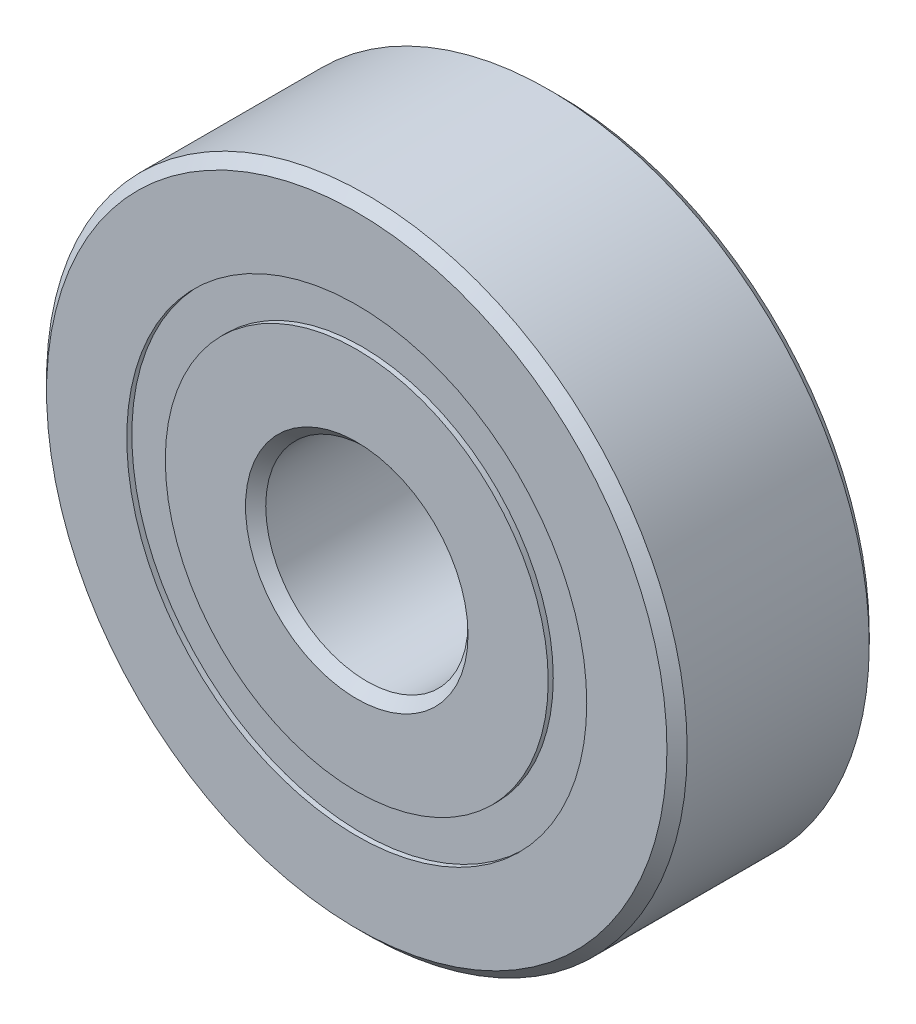
ISO-10303-21;
HEADER;
FILE_DESCRIPTION(('STEP AP214'),'2;1');
FILE_NAME('part.step','',(''),(''),'','','');
FILE_SCHEMA(('AUTOMOTIVE_DESIGN { 1 0 10303 214 1 1 1 1 }'));
ENDSEC;
DATA;
#1=APPLICATION_CONTEXT('core data for automotive mechanical design processes');
#2=APPLICATION_PROTOCOL_DEFINITION('international standard','automotive_design',2000,#1);
#3=PRODUCT_CONTEXT('',#1,'mechanical');
#4=PRODUCT('Part','Part','',(#3));
#5=PRODUCT_RELATED_PRODUCT_CATEGORY('part','',(#4));
#6=PRODUCT_DEFINITION_FORMATION('','',#4);
#7=PRODUCT_DEFINITION_CONTEXT('part definition',#1,'design');
#8=PRODUCT_DEFINITION('design','',#6,#7);
#9=PRODUCT_DEFINITION_SHAPE('','',#8);
#10=(LENGTH_UNIT() NAMED_UNIT(*) SI_UNIT(.MILLI.,.METRE.));
#11=(NAMED_UNIT(*) PLANE_ANGLE_UNIT() SI_UNIT($,.RADIAN.));
#12=(NAMED_UNIT(*) SI_UNIT($,.STERADIAN.) SOLID_ANGLE_UNIT());
#13=UNCERTAINTY_MEASURE_WITH_UNIT(LENGTH_MEASURE(1.E-05),#10,'distance_accuracy_value','');
#14=(GEOMETRIC_REPRESENTATION_CONTEXT(3) GLOBAL_UNCERTAINTY_ASSIGNED_CONTEXT((#13)) GLOBAL_UNIT_ASSIGNED_CONTEXT((#10,
#11,#12)) REPRESENTATION_CONTEXT('',''));
#15=CARTESIAN_POINT('',(0.,0.,0.));
#16=DIRECTION('',(0.,0.,1.));
#17=DIRECTION('',(1.,0.,0.));
#18=AXIS2_PLACEMENT_3D('',#15,#16,#17);
#19=CARTESIAN_POINT('',(0.,6.82142857142857,-2.85));
#20=DIRECTION('',(0.,0.,1.));
#21=DIRECTION('',(1.,0.,0.));
#22=AXIS2_PLACEMENT_3D('',#19,#20,#21);
#23=PLANE('',#22);
#24=CARTESIAN_POINT('',(0.,0.,-2.85));
#25=DIRECTION('',(0.,0.,1.));
#26=DIRECTION('',(1.,0.,0.));
#27=AXIS2_PLACEMENT_3D('',#24,#25,#26);
#28=CIRCLE('',#27,6.82142857142857);
#29=CARTESIAN_POINT('',(6.82142857142857,0.,-2.85));
#30=VERTEX_POINT('',#29);
#31=EDGE_CURVE('E55',#30,#30,#28,.T.);
#32=ORIENTED_EDGE('',*,*,#31,.F.);
#33=EDGE_LOOP('',(#32));
#34=FACE_BOUND('',#33,.T.);
#35=CARTESIAN_POINT('',(0.,0.,-2.85));
#36=DIRECTION('',(0.,0.,1.));
#37=DIRECTION('',(1.,0.,0.));
#38=AXIS2_PLACEMENT_3D('',#35,#36,#37);
#39=CIRCLE('',#38,5.67857142857143);
#40=CARTESIAN_POINT('',(5.67857142857143,0.,-2.85));
#41=VERTEX_POINT('',#40);
#42=EDGE_CURVE('E11',#41,#41,#39,.T.);
#43=ORIENTED_EDGE('',*,*,#42,.T.);
#44=EDGE_LOOP('',(#43));
#45=FACE_BOUND('',#44,.T.);
#46=ADVANCED_FACE('F41',(#34,#45),#23,.F.);
#47=CARTESIAN_POINT('',(0.,0.,3.));
#48=DIRECTION('',(0.,0.,1.));
#49=DIRECTION('',(1.,0.,0.));
#50=AXIS2_PLACEMENT_3D('',#47,#48,#49);
#51=CYLINDRICAL_SURFACE('',#50,5.67857142857143);
#52=ORIENTED_EDGE('',*,*,#42,.F.);
#53=EDGE_LOOP('',(#52));
#54=FACE_BOUND('',#53,.T.);
#55=CARTESIAN_POINT('',(0.,0.,-1.45062344873598));
#56=DIRECTION('',(0.,0.,1.));
#57=DIRECTION('',(1.,0.,0.));
#58=AXIS2_PLACEMENT_3D('',#55,#56,#57);
#59=CIRCLE('',#58,5.67857142857143);
#60=CARTESIAN_POINT('',(5.67857142857143,0.,-1.45062344873598));
#61=VERTEX_POINT('',#60);
#62=EDGE_CURVE('E47',#61,#61,#59,.T.);
#63=ORIENTED_EDGE('',*,*,#62,.T.);
#64=EDGE_LOOP('',(#63));
#65=FACE_BOUND('',#64,.T.);
#66=ADVANCED_FACE('F64',(#54,#65),#51,.F.);
#67=CARTESIAN_POINT('',(0.,6.82142857142857,-1.45062344873598));
#68=DIRECTION('',(0.,0.,-1.));
#69=DIRECTION('',(-1.,0.,0.));
#70=AXIS2_PLACEMENT_3D('',#67,#68,#69);
#71=PLANE('',#70);
#72=ORIENTED_EDGE('',*,*,#62,.F.);
#73=EDGE_LOOP('',(#72));
#74=FACE_BOUND('',#73,.T.);
#75=CARTESIAN_POINT('',(0.,0.,-1.45062344873598));
#76=DIRECTION('',(0.,0.,1.));
#77=DIRECTION('',(1.,0.,0.));
#78=AXIS2_PLACEMENT_3D('',#75,#76,#77);
#79=CIRCLE('',#78,6.82142857142857);
#80=CARTESIAN_POINT('',(6.82142857142857,0.,-1.45062344873598));
#81=VERTEX_POINT('',#80);
#82=EDGE_CURVE('E51',#81,#81,#79,.T.);
#83=ORIENTED_EDGE('',*,*,#82,.T.);
#84=EDGE_LOOP('',(#83));
#85=FACE_BOUND('',#84,.T.);
#86=ADVANCED_FACE('F68',(#74,#85),#71,.F.);
#87=CARTESIAN_POINT('',(0.,0.,3.));
#88=DIRECTION('',(0.,0.,1.));
#89=DIRECTION('',(1.,0.,0.));
#90=AXIS2_PLACEMENT_3D('',#87,#88,#89);
#91=CYLINDRICAL_SURFACE('',#90,6.82142857142857);
#92=ORIENTED_EDGE('',*,*,#82,.F.);
#93=EDGE_LOOP('',(#92));
#94=FACE_BOUND('',#93,.T.);
#95=ORIENTED_EDGE('',*,*,#31,.T.);
#96=EDGE_LOOP('',(#95));
#97=FACE_BOUND('',#96,.T.);
#98=ADVANCED_FACE('F61',(#94,#97),#91,.T.);
#99=CLOSED_SHELL('',(#46,#66,#86,#98));
#100=MANIFOLD_SOLID_BREP('B2',#99);
#101=CARTESIAN_POINT('',(0.,6.82142857142857,2.85));
#102=DIRECTION('',(0.,0.,-1.));
#103=DIRECTION('',(-1.,0.,0.));
#104=AXIS2_PLACEMENT_3D('',#101,#102,#103);
#105=PLANE('',#104);
#106=CARTESIAN_POINT('',(0.,0.,2.85));
#107=DIRECTION('',(0.,0.,1.));
#108=DIRECTION('',(1.,0.,0.));
#109=AXIS2_PLACEMENT_3D('',#106,#107,#108);
#110=CIRCLE('',#109,5.67857142857143);
#111=CARTESIAN_POINT('',(5.67857142857143,0.,2.85));
#112=VERTEX_POINT('',#111);
#113=EDGE_CURVE('E40',#112,#112,#110,.T.);
#114=ORIENTED_EDGE('',*,*,#113,.F.);
#115=EDGE_LOOP('',(#114));
#116=FACE_BOUND('',#115,.T.);
#117=CARTESIAN_POINT('',(0.,0.,2.85));
#118=DIRECTION('',(0.,0.,1.));
#119=DIRECTION('',(1.,0.,0.));
#120=AXIS2_PLACEMENT_3D('',#117,#118,#119);
#121=CIRCLE('',#120,6.82142857142857);
#122=CARTESIAN_POINT('',(6.82142857142857,0.,2.85));
#123=VERTEX_POINT('',#122);
#124=EDGE_CURVE('E122',#123,#123,#121,.T.);
#125=ORIENTED_EDGE('',*,*,#124,.T.);
#126=EDGE_LOOP('',(#125));
#127=FACE_BOUND('',#126,.T.);
#128=ADVANCED_FACE('F108',(#116,#127),#105,.F.);
#129=CARTESIAN_POINT('',(0.,0.,3.));
#130=DIRECTION('',(0.,0.,1.));
#131=DIRECTION('',(1.,0.,0.));
#132=AXIS2_PLACEMENT_3D('',#129,#130,#131);
#133=CYLINDRICAL_SURFACE('',#132,5.67857142857143);
#134=CARTESIAN_POINT('',(0.,0.,1.45062344873598));
#135=DIRECTION('',(0.,0.,1.));
#136=DIRECTION('',(1.,0.,0.));
#137=AXIS2_PLACEMENT_3D('',#134,#135,#136);
#138=CIRCLE('',#137,5.67857142857143);
#139=CARTESIAN_POINT('',(5.67857142857143,0.,1.45062344873598));
#140=VERTEX_POINT('',#139);
#141=EDGE_CURVE('E114',#140,#140,#138,.T.);
#142=ORIENTED_EDGE('',*,*,#141,.F.);
#143=EDGE_LOOP('',(#142));
#144=FACE_BOUND('',#143,.T.);
#145=ORIENTED_EDGE('',*,*,#113,.T.);
#146=EDGE_LOOP('',(#145));
#147=FACE_BOUND('',#146,.T.);
#148=ADVANCED_FACE('F137',(#144,#147),#133,.F.);
#149=CARTESIAN_POINT('',(0.,6.82142857142857,1.45062344873598));
#150=DIRECTION('',(0.,0.,1.));
#151=DIRECTION('',(1.,0.,0.));
#152=AXIS2_PLACEMENT_3D('',#149,#150,#151);
#153=PLANE('',#152);
#154=CARTESIAN_POINT('',(0.,0.,1.45062344873598));
#155=DIRECTION('',(0.,0.,1.));
#156=DIRECTION('',(1.,0.,0.));
#157=AXIS2_PLACEMENT_3D('',#154,#155,#156);
#158=CIRCLE('',#157,6.82142857142857);
#159=CARTESIAN_POINT('',(6.82142857142857,0.,1.45062344873598));
#160=VERTEX_POINT('',#159);
#161=EDGE_CURVE('E118',#160,#160,#158,.T.);
#162=ORIENTED_EDGE('',*,*,#161,.F.);
#163=EDGE_LOOP('',(#162));
#164=FACE_BOUND('',#163,.T.);
#165=ORIENTED_EDGE('',*,*,#141,.T.);
#166=EDGE_LOOP('',(#165));
#167=FACE_BOUND('',#166,.T.);
#168=ADVANCED_FACE('F132',(#164,#167),#153,.F.);
#169=CARTESIAN_POINT('',(0.,0.,3.));
#170=DIRECTION('',(0.,0.,1.));
#171=DIRECTION('',(1.,0.,0.));
#172=AXIS2_PLACEMENT_3D('',#169,#170,#171);
#173=CYLINDRICAL_SURFACE('',#172,6.82142857142857);
#174=ORIENTED_EDGE('',*,*,#124,.F.);
#175=EDGE_LOOP('',(#174));
#176=FACE_BOUND('',#175,.T.);
#177=ORIENTED_EDGE('',*,*,#161,.T.);
#178=EDGE_LOOP('',(#177));
#179=FACE_BOUND('',#178,.T.);
#180=ADVANCED_FACE('F129',(#176,#179),#173,.T.);
#181=CLOSED_SHELL('',(#128,#148,#168,#180));
#182=MANIFOLD_SOLID_BREP('B6',#181);
#183=CARTESIAN_POINT('',(-2.71177336948466,5.63105542439015,0.));
#184=DIRECTION('',(0.,0.,1.));
#185=DIRECTION('',(-0.433883739117546,0.900968867902425,0.));
#186=AXIS2_PLACEMENT_3D('',#183,#184,#185);
#187=SPHERICAL_SURFACE('',#186,1.45062344873598);
#188=CARTESIAN_POINT('',(-2.71177336948466,5.63105542439015,1.45062344873598));
#189=VERTEX_POINT('',#188);
#190=VERTEX_LOOP('',#189);
#191=FACE_BOUND('',#190,.T.);
#192=ADVANCED_FACE('F175',(#191),#187,.T.);
#193=CLOSED_SHELL('',(#192));
#194=MANIFOLD_SOLID_BREP('B35',#193);
#195=CARTESIAN_POINT('',(-4.88644676542514,3.89681126161714,0.));
#196=DIRECTION('',(0.,0.,1.));
#197=DIRECTION('',(-0.781831482468022,0.623489801858743,0.));
#198=AXIS2_PLACEMENT_3D('',#195,#196,#197);
#199=SPHERICAL_SURFACE('',#198,1.45062344873598);
#200=CARTESIAN_POINT('',(-4.88644676542514,3.89681126161714,1.45062344873598));
#201=VERTEX_POINT('',#200);
#202=VERTEX_LOOP('',#201);
#203=FACE_BOUND('',#202,.T.);
#204=ADVANCED_FACE('F195',(#203),#199,.T.);
#205=CLOSED_SHELL('',(#204));
#206=MANIFOLD_SOLID_BREP('B104',#205);
#207=CARTESIAN_POINT('',(-6.09329945113638,1.39075583722703,0.));
#208=DIRECTION('',(0.,0.,1.));
#209=DIRECTION('',(-0.974927912181821,0.222520933956325,0.));
#210=AXIS2_PLACEMENT_3D('',#207,#208,#209);
#211=SPHERICAL_SURFACE('',#210,1.45062344873598);
#212=CARTESIAN_POINT('',(-6.09329945113638,1.39075583722703,1.45062344873598));
#213=VERTEX_POINT('',#212);
#214=VERTEX_LOOP('',#213);
#215=FACE_BOUND('',#214,.T.);
#216=ADVANCED_FACE('F215',(#215),#211,.T.);
#217=CLOSED_SHELL('',(#216));
#218=MANIFOLD_SOLID_BREP('B171',#217);
#219=CARTESIAN_POINT('',(-6.09329945113641,-1.39075583722691,0.));
#220=DIRECTION('',(0.,0.,1.));
#221=DIRECTION('',(-0.974927912181826,-0.222520933956305,0.));
#222=AXIS2_PLACEMENT_3D('',#219,#220,#221);
#223=SPHERICAL_SURFACE('',#222,1.45062344873598);
#224=CARTESIAN_POINT('',(-6.09329945113641,-1.39075583722691,1.45062344873598));
#225=VERTEX_POINT('',#224);
#226=VERTEX_LOOP('',#225);
#227=FACE_BOUND('',#226,.T.);
#228=ADVANCED_FACE('F235',(#227),#223,.T.);
#229=CLOSED_SHELL('',(#228));
#230=MANIFOLD_SOLID_BREP('B191',#229);
#231=CARTESIAN_POINT('',(-4.88644676542522,-3.89681126161704,0.));
#232=DIRECTION('',(0.,0.,1.));
#233=DIRECTION('',(-0.781831482468035,-0.623489801858727,0.));
#234=AXIS2_PLACEMENT_3D('',#231,#232,#233);
#235=SPHERICAL_SURFACE('',#234,1.45062344873598);
#236=CARTESIAN_POINT('',(-4.88644676542522,-3.89681126161704,1.45062344873598));
#237=VERTEX_POINT('',#236);
#238=VERTEX_LOOP('',#237);
#239=FACE_BOUND('',#238,.T.);
#240=ADVANCED_FACE('F255',(#239),#235,.T.);
#241=CLOSED_SHELL('',(#240));
#242=MANIFOLD_SOLID_BREP('B211',#241);
#243=CARTESIAN_POINT('',(-2.71177336948478,-5.6310554243901,0.));
#244=DIRECTION('',(0.,0.,1.));
#245=DIRECTION('',(-0.433883739117565,-0.900968867902416,0.));
#246=AXIS2_PLACEMENT_3D('',#243,#244,#245);
#247=SPHERICAL_SURFACE('',#246,1.45062344873598);
#248=CARTESIAN_POINT('',(-2.71177336948478,-5.6310554243901,1.45062344873598));
#249=VERTEX_POINT('',#248);
#250=VERTEX_LOOP('',#249);
#251=FACE_BOUND('',#250,.T.);
#252=ADVANCED_FACE('F275',(#251),#247,.T.);
#253=CLOSED_SHELL('',(#252));
#254=MANIFOLD_SOLID_BREP('B231',#253);
#255=CARTESIAN_POINT('',(0.,-6.25,0.));
#256=DIRECTION('',(0.,0.,1.));
#257=DIRECTION('',(0.,-1.,0.));
#258=AXIS2_PLACEMENT_3D('',#255,#256,#257);
#259=SPHERICAL_SURFACE('',#258,1.45062344873598);
#260=CARTESIAN_POINT('',(0.,-6.25,1.45062344873598));
#261=VERTEX_POINT('',#260);
#262=VERTEX_LOOP('',#261);
#263=FACE_BOUND('',#262,.T.);
#264=ADVANCED_FACE('F295',(#263),#259,.T.);
#265=CLOSED_SHELL('',(#264));
#266=MANIFOLD_SOLID_BREP('B251',#265);
#267=CARTESIAN_POINT('',(2.7117733694847,-5.63105542439014,0.));
#268=DIRECTION('',(0.,0.,1.));
#269=DIRECTION('',(0.433883739117553,-0.900968867902422,0.));
#270=AXIS2_PLACEMENT_3D('',#267,#268,#269);
#271=SPHERICAL_SURFACE('',#270,1.45062344873598);
#272=CARTESIAN_POINT('',(2.7117733694847,-5.63105542439014,1.45062344873598));
#273=VERTEX_POINT('',#272);
#274=VERTEX_LOOP('',#273);
#275=FACE_BOUND('',#274,.T.);
#276=ADVANCED_FACE('F315',(#275),#271,.T.);
#277=CLOSED_SHELL('',(#276));
#278=MANIFOLD_SOLID_BREP('B271',#277);
#279=CARTESIAN_POINT('',(4.88644676542517,-3.89681126161711,0.));
#280=DIRECTION('',(0.,0.,1.));
#281=DIRECTION('',(0.781831482468027,-0.623489801858737,0.));
#282=AXIS2_PLACEMENT_3D('',#279,#280,#281);
#283=SPHERICAL_SURFACE('',#282,1.45062344873598);
#284=CARTESIAN_POINT('',(4.88644676542517,-3.89681126161711,1.45062344873598));
#285=VERTEX_POINT('',#284);
#286=VERTEX_LOOP('',#285);
#287=FACE_BOUND('',#286,.T.);
#288=ADVANCED_FACE('F335',(#287),#283,.T.);
#289=CLOSED_SHELL('',(#288));
#290=MANIFOLD_SOLID_BREP('B291',#289);
#291=CARTESIAN_POINT('',(6.09329945113639,-1.39075583722699,0.));
#292=DIRECTION('',(0.,0.,1.));
#293=DIRECTION('',(0.974927912181823,-0.222520933956318,0.));
#294=AXIS2_PLACEMENT_3D('',#291,#292,#293);
#295=SPHERICAL_SURFACE('',#294,1.45062344873598);
#296=CARTESIAN_POINT('',(6.09329945113639,-1.39075583722699,1.45062344873598));
#297=VERTEX_POINT('',#296);
#298=VERTEX_LOOP('',#297);
#299=FACE_BOUND('',#298,.T.);
#300=ADVANCED_FACE('F355',(#299),#295,.T.);
#301=CLOSED_SHELL('',(#300));
#302=MANIFOLD_SOLID_BREP('B311',#301);
#303=CARTESIAN_POINT('',(6.0932994511364,1.39075583722695,0.));
#304=DIRECTION('',(0.,0.,1.));
#305=DIRECTION('',(0.974927912181824,0.222520933956311,0.));
#306=AXIS2_PLACEMENT_3D('',#303,#304,#305);
#307=SPHERICAL_SURFACE('',#306,1.45062344873598);
#308=CARTESIAN_POINT('',(6.0932994511364,1.39075583722695,1.45062344873598));
#309=VERTEX_POINT('',#308);
#310=VERTEX_LOOP('',#309);
#311=FACE_BOUND('',#310,.T.);
#312=ADVANCED_FACE('F375',(#311),#307,.T.);
#313=CLOSED_SHELL('',(#312));
#314=MANIFOLD_SOLID_BREP('B331',#313);
#315=CARTESIAN_POINT('',(4.88644676542519,3.89681126161708,0.));
#316=DIRECTION('',(0.,0.,1.));
#317=DIRECTION('',(0.781831482468031,0.623489801858732,0.));
#318=AXIS2_PLACEMENT_3D('',#315,#316,#317);
#319=SPHERICAL_SURFACE('',#318,1.45062344873598);
#320=CARTESIAN_POINT('',(4.88644676542519,3.89681126161708,1.45062344873598));
#321=VERTEX_POINT('',#320);
#322=VERTEX_LOOP('',#321);
#323=FACE_BOUND('',#322,.T.);
#324=ADVANCED_FACE('F395',(#323),#319,.T.);
#325=CLOSED_SHELL('',(#324));
#326=MANIFOLD_SOLID_BREP('B351',#325);
#327=CARTESIAN_POINT('',(2.71177336948474,5.63105542439012,0.));
#328=DIRECTION('',(0.,0.,1.));
#329=DIRECTION('',(0.433883739117559,0.900968867902419,0.));
#330=AXIS2_PLACEMENT_3D('',#327,#328,#329);
#331=SPHERICAL_SURFACE('',#330,1.45062344873598);
#332=CARTESIAN_POINT('',(2.71177336948474,5.63105542439012,1.45062344873598));
#333=VERTEX_POINT('',#332);
#334=VERTEX_LOOP('',#333);
#335=FACE_BOUND('',#334,.T.);
#336=ADVANCED_FACE('F415',(#335),#331,.T.);
#337=CLOSED_SHELL('',(#336));
#338=MANIFOLD_SOLID_BREP('B371',#337);
#339=CARTESIAN_POINT('',(0.,6.25,0.));
#340=DIRECTION('',(0.,0.,1.));
#341=DIRECTION('',(0.,1.,0.));
#342=AXIS2_PLACEMENT_3D('',#339,#340,#341);
#343=SPHERICAL_SURFACE('',#342,1.45062344873598);
#344=CARTESIAN_POINT('',(0.,6.25,1.45062344873598));
#345=VERTEX_POINT('',#344);
#346=VERTEX_LOOP('',#345);
#347=FACE_BOUND('',#346,.T.);
#348=ADVANCED_FACE('F437',(#347),#343,.T.);
#349=CLOSED_SHELL('',(#348));
#350=MANIFOLD_SOLID_BREP('B391',#349);
#351=CARTESIAN_POINT('',(0.,5.67857142857143,3.));
#352=DIRECTION('',(0.,0.,-1.));
#353=DIRECTION('',(-1.,0.,0.));
#354=AXIS2_PLACEMENT_3D('',#351,#352,#353);
#355=PLANE('',#354);
#356=CARTESIAN_POINT('',(0.,0.,3.));
#357=DIRECTION('',(0.,0.,1.));
#358=DIRECTION('',(1.,0.,0.));
#359=AXIS2_PLACEMENT_3D('',#356,#357,#358);
#360=CIRCLE('',#359,3.3);
#361=CARTESIAN_POINT('',(3.3,0.,3.));
#362=VERTEX_POINT('',#361);
#363=EDGE_CURVE('E484',#362,#362,#360,.T.);
#364=ORIENTED_EDGE('',*,*,#363,.F.);
#365=EDGE_LOOP('',(#364));
#366=FACE_BOUND('',#365,.T.);
#367=CARTESIAN_POINT('',(0.,0.,3.));
#368=DIRECTION('',(0.,0.,1.));
#369=DIRECTION('',(1.,0.,0.));
#370=AXIS2_PLACEMENT_3D('',#367,#368,#369);
#371=CIRCLE('',#370,5.67857142857143);
#372=CARTESIAN_POINT('',(5.67857142857143,0.,3.));
#373=VERTEX_POINT('',#372);
#374=EDGE_CURVE('E436',#373,#373,#371,.T.);
#375=ORIENTED_EDGE('',*,*,#374,.T.);
#376=EDGE_LOOP('',(#375));
#377=FACE_BOUND('',#376,.T.);
#378=ADVANCED_FACE('F456',(#366,#377),#355,.F.);
#379=CARTESIAN_POINT('',(0.,0.,3.));
#380=DIRECTION('',(0.,0.,1.));
#381=DIRECTION('',(1.,0.,0.));
#382=AXIS2_PLACEMENT_3D('',#379,#380,#381);
#383=CYLINDRICAL_SURFACE('',#382,5.67857142857143);
#384=ORIENTED_EDGE('',*,*,#374,.F.);
#385=EDGE_LOOP('',(#384));
#386=FACE_BOUND('',#385,.T.);
#387=CARTESIAN_POINT('',(0.,0.,1.33333333333333));
#388=DIRECTION('',(0.,0.,1.));
#389=DIRECTION('',(1.,0.,0.));
#390=AXIS2_PLACEMENT_3D('',#387,#388,#389);
#391=CIRCLE('',#390,5.67857142857143);
#392=CARTESIAN_POINT('',(5.67857142857143,0.,1.33333333333333));
#393=VERTEX_POINT('',#392);
#394=EDGE_CURVE('E462',#393,#393,#391,.T.);
#395=ORIENTED_EDGE('',*,*,#394,.T.);
#396=EDGE_LOOP('',(#395));
#397=FACE_BOUND('',#396,.T.);
#398=ADVANCED_FACE('F491',(#386,#397),#383,.T.);
#399=CARTESIAN_POINT('',(0.,0.,0.));
#400=DIRECTION('',(0.,0.,1.));
#401=DIRECTION('',(1.,0.,0.));
#402=AXIS2_PLACEMENT_3D('',#399,#400,#401);
#403=TOROIDAL_SURFACE('',#402,6.25,1.45062344873598);
#404=ORIENTED_EDGE('',*,*,#394,.F.);
#405=EDGE_LOOP('',(#404));
#406=FACE_BOUND('',#405,.T.);
#407=CARTESIAN_POINT('',(0.,0.,-1.33333333333333));
#408=DIRECTION('',(0.,0.,1.));
#409=DIRECTION('',(1.,0.,0.));
#410=AXIS2_PLACEMENT_3D('',#407,#408,#409);
#411=CIRCLE('',#410,5.67857142857143);
#412=CARTESIAN_POINT('',(5.67857142857143,0.,-1.33333333333333));
#413=VERTEX_POINT('',#412);
#414=EDGE_CURVE('E466',#413,#413,#411,.T.);
#415=ORIENTED_EDGE('',*,*,#414,.T.);
#416=EDGE_LOOP('',(#415));
#417=FACE_BOUND('',#416,.T.);
#418=ADVANCED_FACE('F495',(#406,#417),#403,.F.);
#419=CARTESIAN_POINT('',(0.,0.,3.));
#420=DIRECTION('',(0.,0.,1.));
#421=DIRECTION('',(1.,0.,0.));
#422=AXIS2_PLACEMENT_3D('',#419,#420,#421);
#423=CYLINDRICAL_SURFACE('',#422,5.67857142857143);
#424=ORIENTED_EDGE('',*,*,#414,.F.);
#425=EDGE_LOOP('',(#424));
#426=FACE_BOUND('',#425,.T.);
#427=CARTESIAN_POINT('',(0.,0.,-3.));
#428=DIRECTION('',(0.,0.,1.));
#429=DIRECTION('',(1.,0.,0.));
#430=AXIS2_PLACEMENT_3D('',#427,#428,#429);
#431=CIRCLE('',#430,5.67857142857143);
#432=CARTESIAN_POINT('',(5.67857142857143,0.,-3.));
#433=VERTEX_POINT('',#432);
#434=EDGE_CURVE('E470',#433,#433,#431,.T.);
#435=ORIENTED_EDGE('',*,*,#434,.T.);
#436=EDGE_LOOP('',(#435));
#437=FACE_BOUND('',#436,.T.);
#438=ADVANCED_FACE('F500',(#426,#437),#423,.T.);
#439=CARTESIAN_POINT('',(0.,3.3,-3.));
#440=DIRECTION('',(0.,0.,1.));
#441=DIRECTION('',(1.,0.,0.));
#442=AXIS2_PLACEMENT_3D('',#439,#440,#441);
#443=PLANE('',#442);
#444=ORIENTED_EDGE('',*,*,#434,.F.);
#445=EDGE_LOOP('',(#444));
#446=FACE_BOUND('',#445,.T.);
#447=CARTESIAN_POINT('',(0.,0.,-3.));
#448=DIRECTION('',(0.,0.,1.));
#449=DIRECTION('',(1.,0.,0.));
#450=AXIS2_PLACEMENT_3D('',#447,#448,#449);
#451=CIRCLE('',#450,3.3);
#452=CARTESIAN_POINT('',(3.3,0.,-3.));
#453=VERTEX_POINT('',#452);
#454=EDGE_CURVE('E475',#453,#453,#451,.T.);
#455=ORIENTED_EDGE('',*,*,#454,.T.);
#456=EDGE_LOOP('',(#455));
#457=FACE_BOUND('',#456,.T.);
#458=ADVANCED_FACE('F506',(#446,#457),#443,.F.);
#459=CARTESIAN_POINT('',(0.,0.,-2.7));
#460=DIRECTION('',(0.,0.,-1.));
#461=DIRECTION('',(-1.,0.,0.));
#462=AXIS2_PLACEMENT_3D('',#459,#460,#461);
#463=CONICAL_SURFACE('',#462,3.,0.785398163397447);
#464=ORIENTED_EDGE('',*,*,#454,.F.);
#465=EDGE_LOOP('',(#464));
#466=FACE_BOUND('',#465,.T.);
#467=CARTESIAN_POINT('',(0.,0.,-2.7));
#468=DIRECTION('',(0.,0.,1.));
#469=DIRECTION('',(1.,0.,0.));
#470=AXIS2_PLACEMENT_3D('',#467,#468,#469);
#471=CIRCLE('',#470,3.);
#472=CARTESIAN_POINT('',(3.,0.,-2.7));
#473=VERTEX_POINT('',#472);
#474=EDGE_CURVE('E478',#473,#473,#471,.T.);
#475=ORIENTED_EDGE('',*,*,#474,.T.);
#476=EDGE_LOOP('',(#475));
#477=FACE_BOUND('',#476,.T.);
#478=ADVANCED_FACE('F510',(#466,#477),#463,.F.);
#479=CARTESIAN_POINT('',(0.,0.,3.));
#480=DIRECTION('',(0.,0.,1.));
#481=DIRECTION('',(1.,0.,0.));
#482=AXIS2_PLACEMENT_3D('',#479,#480,#481);
#483=CYLINDRICAL_SURFACE('',#482,3.);
#484=ORIENTED_EDGE('',*,*,#474,.F.);
#485=EDGE_LOOP('',(#484));
#486=FACE_BOUND('',#485,.T.);
#487=CARTESIAN_POINT('',(0.,0.,2.7));
#488=DIRECTION('',(0.,0.,1.));
#489=DIRECTION('',(1.,0.,0.));
#490=AXIS2_PLACEMENT_3D('',#487,#488,#489);
#491=CIRCLE('',#490,3.);
#492=CARTESIAN_POINT('',(3.,0.,2.7));
#493=VERTEX_POINT('',#492);
#494=EDGE_CURVE('E481',#493,#493,#491,.T.);
#495=ORIENTED_EDGE('',*,*,#494,.T.);
#496=EDGE_LOOP('',(#495));
#497=FACE_BOUND('',#496,.T.);
#498=ADVANCED_FACE('F514',(#486,#497),#483,.F.);
#499=CARTESIAN_POINT('',(0.,0.,3.));
#500=DIRECTION('',(0.,0.,1.));
#501=DIRECTION('',(1.,0.,0.));
#502=AXIS2_PLACEMENT_3D('',#499,#500,#501);
#503=CONICAL_SURFACE('',#502,3.3,0.78539816339745);
#504=ORIENTED_EDGE('',*,*,#494,.F.);
#505=EDGE_LOOP('',(#504));
#506=FACE_BOUND('',#505,.T.);
#507=ORIENTED_EDGE('',*,*,#363,.T.);
#508=EDGE_LOOP('',(#507));
#509=FACE_BOUND('',#508,.T.);
#510=ADVANCED_FACE('F488',(#506,#509),#503,.F.);
#511=CLOSED_SHELL('',(#378,#398,#418,#438,#458,#478,#498,#510));
#512=MANIFOLD_SOLID_BREP('B411',#511);
#513=CARTESIAN_POINT('',(0.,0.,2.7));
#514=DIRECTION('',(0.,0.,-1.));
#515=DIRECTION('',(-1.,0.,0.));
#516=AXIS2_PLACEMENT_3D('',#513,#514,#515);
#517=CONICAL_SURFACE('',#516,9.5,0.785398163397445);
#518=CARTESIAN_POINT('',(0.,0.,3.));
#519=DIRECTION('',(0.,0.,1.));
#520=DIRECTION('',(1.,0.,0.));
#521=AXIS2_PLACEMENT_3D('',#518,#519,#520);
#522=CIRCLE('',#521,9.2);
#523=CARTESIAN_POINT('',(9.2,0.,3.));
#524=VERTEX_POINT('',#523);
#525=EDGE_CURVE('E605',#524,#524,#522,.T.);
#526=ORIENTED_EDGE('',*,*,#525,.F.);
#527=EDGE_LOOP('',(#526));
#528=FACE_BOUND('',#527,.T.);
#529=CARTESIAN_POINT('',(0.,0.,2.7));
#530=DIRECTION('',(0.,0.,1.));
#531=DIRECTION('',(1.,0.,0.));
#532=AXIS2_PLACEMENT_3D('',#529,#530,#531);
#533=CIRCLE('',#532,9.5);
#534=CARTESIAN_POINT('',(9.5,0.,2.7));
#535=VERTEX_POINT('',#534);
#536=EDGE_CURVE('E455',#535,#535,#533,.T.);
#537=ORIENTED_EDGE('',*,*,#536,.T.);
#538=EDGE_LOOP('',(#537));
#539=FACE_BOUND('',#538,.T.);
#540=ADVANCED_FACE('F577',(#528,#539),#517,.T.);
#541=CARTESIAN_POINT('',(0.,0.,3.));
#542=DIRECTION('',(0.,0.,1.));
#543=DIRECTION('',(1.,0.,0.));
#544=AXIS2_PLACEMENT_3D('',#541,#542,#543);
#545=CYLINDRICAL_SURFACE('',#544,9.5);
#546=ORIENTED_EDGE('',*,*,#536,.F.);
#547=EDGE_LOOP('',(#546));
#548=FACE_BOUND('',#547,.T.);
#549=CARTESIAN_POINT('',(0.,0.,-2.7));
#550=DIRECTION('',(0.,0.,1.));
#551=DIRECTION('',(1.,0.,0.));
#552=AXIS2_PLACEMENT_3D('',#549,#550,#551);
#553=CIRCLE('',#552,9.5);
#554=CARTESIAN_POINT('',(9.5,0.,-2.7));
#555=VERTEX_POINT('',#554);
#556=EDGE_CURVE('E583',#555,#555,#553,.T.);
#557=ORIENTED_EDGE('',*,*,#556,.T.);
#558=EDGE_LOOP('',(#557));
#559=FACE_BOUND('',#558,.T.);
#560=ADVANCED_FACE('F612',(#548,#559),#545,.T.);
#561=CARTESIAN_POINT('',(0.,0.,-3.));
#562=DIRECTION('',(0.,0.,1.));
#563=DIRECTION('',(1.,0.,0.));
#564=AXIS2_PLACEMENT_3D('',#561,#562,#563);
#565=CONICAL_SURFACE('',#564,9.2,0.785398163397445);
#566=ORIENTED_EDGE('',*,*,#556,.F.);
#567=EDGE_LOOP('',(#566));
#568=FACE_BOUND('',#567,.T.);
#569=CARTESIAN_POINT('',(0.,0.,-3.));
#570=DIRECTION('',(0.,0.,1.));
#571=DIRECTION('',(1.,0.,0.));
#572=AXIS2_PLACEMENT_3D('',#569,#570,#571);
#573=CIRCLE('',#572,9.2);
#574=CARTESIAN_POINT('',(9.2,0.,-3.));
#575=VERTEX_POINT('',#574);
#576=EDGE_CURVE('E587',#575,#575,#573,.T.);
#577=ORIENTED_EDGE('',*,*,#576,.T.);
#578=EDGE_LOOP('',(#577));
#579=FACE_BOUND('',#578,.T.);
#580=ADVANCED_FACE('F616',(#568,#579),#565,.T.);
#581=CARTESIAN_POINT('',(0.,9.2,-3.));
#582=DIRECTION('',(0.,0.,1.));
#583=DIRECTION('',(1.,0.,0.));
#584=AXIS2_PLACEMENT_3D('',#581,#582,#583);
#585=PLANE('',#584);
#586=ORIENTED_EDGE('',*,*,#576,.F.);
#587=EDGE_LOOP('',(#586));
#588=FACE_BOUND('',#587,.T.);
#589=CARTESIAN_POINT('',(0.,0.,-3.));
#590=DIRECTION('',(0.,0.,1.));
#591=DIRECTION('',(1.,0.,0.));
#592=AXIS2_PLACEMENT_3D('',#589,#590,#591);
#593=CIRCLE('',#592,6.82142857142857);
#594=CARTESIAN_POINT('',(6.82142857142857,0.,-3.));
#595=VERTEX_POINT('',#594);
#596=EDGE_CURVE('E591',#595,#595,#593,.T.);
#597=ORIENTED_EDGE('',*,*,#596,.T.);
#598=EDGE_LOOP('',(#597));
#599=FACE_BOUND('',#598,.T.);
#600=ADVANCED_FACE('F621',(#588,#599),#585,.F.);
#601=CARTESIAN_POINT('',(0.,0.,3.));
#602=DIRECTION('',(0.,0.,1.));
#603=DIRECTION('',(1.,0.,0.));
#604=AXIS2_PLACEMENT_3D('',#601,#602,#603);
#605=CYLINDRICAL_SURFACE('',#604,6.82142857142857);
#606=ORIENTED_EDGE('',*,*,#596,.F.);
#607=EDGE_LOOP('',(#606));
#608=FACE_BOUND('',#607,.T.);
#609=CARTESIAN_POINT('',(0.,0.,-1.33333333333333));
#610=DIRECTION('',(0.,0.,1.));
#611=DIRECTION('',(1.,0.,0.));
#612=AXIS2_PLACEMENT_3D('',#609,#610,#611);
#613=CIRCLE('',#612,6.82142857142857);
#614=CARTESIAN_POINT('',(6.82142857142857,0.,-1.33333333333333));
#615=VERTEX_POINT('',#614);
#616=EDGE_CURVE('E596',#615,#615,#613,.T.);
#617=ORIENTED_EDGE('',*,*,#616,.T.);
#618=EDGE_LOOP('',(#617));
#619=FACE_BOUND('',#618,.T.);
#620=ADVANCED_FACE('F627',(#608,#619),#605,.F.);
#621=CARTESIAN_POINT('',(0.,0.,0.));
#622=DIRECTION('',(0.,0.,1.));
#623=DIRECTION('',(1.,0.,0.));
#624=AXIS2_PLACEMENT_3D('',#621,#622,#623);
#625=TOROIDAL_SURFACE('',#624,6.25,1.45062344873598);
#626=ORIENTED_EDGE('',*,*,#616,.F.);
#627=EDGE_LOOP('',(#626));
#628=FACE_BOUND('',#627,.T.);
#629=CARTESIAN_POINT('',(0.,0.,1.33333333333333));
#630=DIRECTION('',(0.,0.,1.));
#631=DIRECTION('',(1.,0.,0.));
#632=AXIS2_PLACEMENT_3D('',#629,#630,#631);
#633=CIRCLE('',#632,6.82142857142857);
#634=CARTESIAN_POINT('',(6.82142857142857,0.,1.33333333333333));
#635=VERTEX_POINT('',#634);
#636=EDGE_CURVE('E599',#635,#635,#633,.T.);
#637=ORIENTED_EDGE('',*,*,#636,.T.);
#638=EDGE_LOOP('',(#637));
#639=FACE_BOUND('',#638,.T.);
#640=ADVANCED_FACE('F631',(#628,#639),#625,.F.);
#641=CARTESIAN_POINT('',(0.,0.,3.));
#642=DIRECTION('',(0.,0.,1.));
#643=DIRECTION('',(1.,0.,0.));
#644=AXIS2_PLACEMENT_3D('',#641,#642,#643);
#645=CYLINDRICAL_SURFACE('',#644,6.82142857142857);
#646=ORIENTED_EDGE('',*,*,#636,.F.);
#647=EDGE_LOOP('',(#646));
#648=FACE_BOUND('',#647,.T.);
#649=CARTESIAN_POINT('',(0.,0.,3.));
#650=DIRECTION('',(0.,0.,1.));
#651=DIRECTION('',(1.,0.,0.));
#652=AXIS2_PLACEMENT_3D('',#649,#650,#651);
#653=CIRCLE('',#652,6.82142857142857);
#654=CARTESIAN_POINT('',(6.82142857142857,0.,3.));
#655=VERTEX_POINT('',#654);
#656=EDGE_CURVE('E602',#655,#655,#653,.T.);
#657=ORIENTED_EDGE('',*,*,#656,.T.);
#658=EDGE_LOOP('',(#657));
#659=FACE_BOUND('',#658,.T.);
#660=ADVANCED_FACE('F635',(#648,#659),#645,.F.);
#661=CARTESIAN_POINT('',(0.,9.2,3.));
#662=DIRECTION('',(0.,0.,-1.));
#663=DIRECTION('',(-1.,0.,0.));
#664=AXIS2_PLACEMENT_3D('',#661,#662,#663);
#665=PLANE('',#664);
#666=ORIENTED_EDGE('',*,*,#656,.F.);
#667=EDGE_LOOP('',(#666));
#668=FACE_BOUND('',#667,.T.);
#669=ORIENTED_EDGE('',*,*,#525,.T.);
#670=EDGE_LOOP('',(#669));
#671=FACE_BOUND('',#670,.T.);
#672=ADVANCED_FACE('F609',(#668,#671),#665,.F.);
#673=CLOSED_SHELL('',(#540,#560,#580,#600,#620,#640,#660,#672));
#674=MANIFOLD_SOLID_BREP('B431',#673);
#675=ADVANCED_BREP_SHAPE_REPRESENTATION('',(#18,#100,#182,#194,#206,#218,#230,#242,#254,#266,
#278,#290,#302,#314,#326,#338,#350,#512,#674),#14);
#676=SHAPE_DEFINITION_REPRESENTATION(#9,#675);
ENDSEC;
END-ISO-10303-21;
